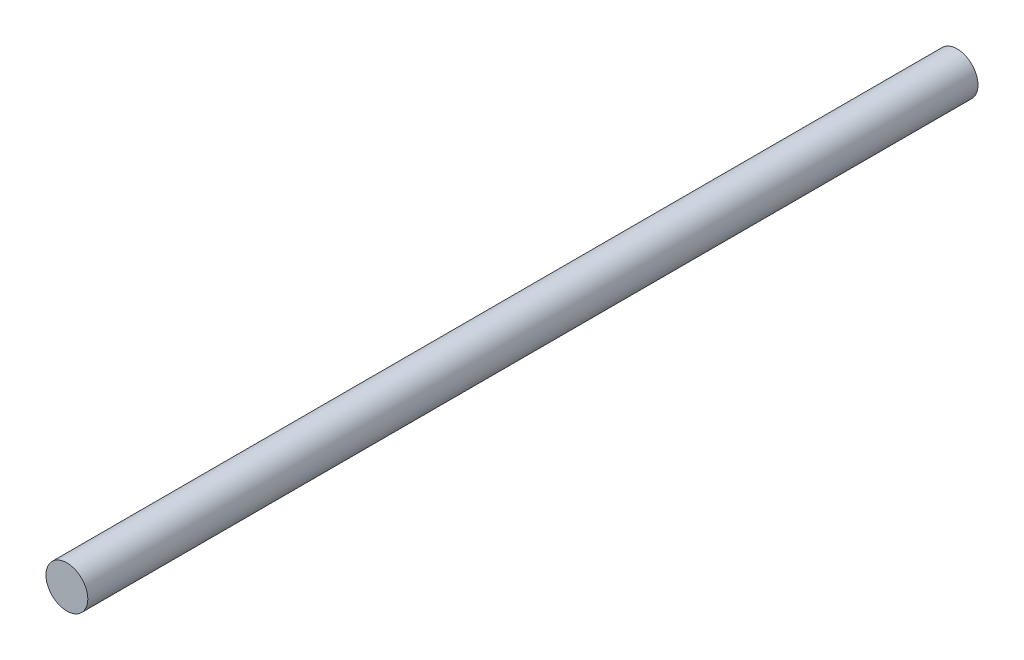
ISO-10303-21;
HEADER;
FILE_DESCRIPTION(('STEP AP214'),'2;1');
FILE_NAME('part.step','',(''),(''),'','','');
FILE_SCHEMA(('AUTOMOTIVE_DESIGN { 1 0 10303 214 1 1 1 1 }'));
ENDSEC;
DATA;
#1=APPLICATION_CONTEXT('core data for automotive mechanical design processes');
#2=APPLICATION_PROTOCOL_DEFINITION('international standard','automotive_design',2000,#1);
#3=PRODUCT_CONTEXT('',#1,'mechanical');
#4=PRODUCT('Part','Part','',(#3));
#5=PRODUCT_RELATED_PRODUCT_CATEGORY('part','',(#4));
#6=PRODUCT_DEFINITION_FORMATION('','',#4);
#7=PRODUCT_DEFINITION_CONTEXT('part definition',#1,'design');
#8=PRODUCT_DEFINITION('design','',#6,#7);
#9=PRODUCT_DEFINITION_SHAPE('','',#8);
#10=(LENGTH_UNIT() NAMED_UNIT(*) SI_UNIT(.MILLI.,.METRE.));
#11=(NAMED_UNIT(*) PLANE_ANGLE_UNIT() SI_UNIT($,.RADIAN.));
#12=(NAMED_UNIT(*) SI_UNIT($,.STERADIAN.) SOLID_ANGLE_UNIT());
#13=UNCERTAINTY_MEASURE_WITH_UNIT(LENGTH_MEASURE(1.E-05),#10,'distance_accuracy_value','');
#14=(GEOMETRIC_REPRESENTATION_CONTEXT(3) GLOBAL_UNCERTAINTY_ASSIGNED_CONTEXT((#13)) GLOBAL_UNIT_ASSIGNED_CONTEXT((#10,
#11,#12)) REPRESENTATION_CONTEXT('',''));
#15=CARTESIAN_POINT('',(0.,0.,0.));
#16=DIRECTION('',(0.,0.,1.));
#17=DIRECTION('',(1.,0.,0.));
#18=AXIS2_PLACEMENT_3D('',#15,#16,#17);
#19=CARTESIAN_POINT('',(0.,0.,-800.));
#20=DIRECTION('',(0.,0.,1.));
#21=DIRECTION('',(1.,0.,0.));
#22=AXIS2_PLACEMENT_3D('',#19,#20,#21);
#23=CYLINDRICAL_SURFACE('',#22,18.8);
#24=CARTESIAN_POINT('',(0.,0.,-800.));
#25=DIRECTION('',(0.,0.,1.));
#26=DIRECTION('',(1.,0.,0.));
#27=AXIS2_PLACEMENT_3D('',#24,#25,#26);
#28=CIRCLE('',#27,18.8);
#29=CARTESIAN_POINT('',(18.8,0.,-800.));
#30=VERTEX_POINT('',#29);
#31=EDGE_CURVE('E10',#30,#30,#28,.T.);
#32=ORIENTED_EDGE('',*,*,#31,.T.);
#33=EDGE_LOOP('',(#32));
#34=FACE_BOUND('',#33,.T.);
#35=CARTESIAN_POINT('',(0.,0.,0.));
#36=DIRECTION('',(0.,0.,1.));
#37=DIRECTION('',(1.,0.,0.));
#38=AXIS2_PLACEMENT_3D('',#35,#36,#37);
#39=CIRCLE('',#38,18.8);
#40=CARTESIAN_POINT('',(18.8,0.,0.));
#41=VERTEX_POINT('',#40);
#42=EDGE_CURVE('E40',#41,#41,#39,.T.);
#43=ORIENTED_EDGE('',*,*,#42,.F.);
#44=EDGE_LOOP('',(#43));
#45=FACE_BOUND('',#44,.T.);
#46=ADVANCED_FACE('F37',(#34,#45),#23,.T.);
#47=CARTESIAN_POINT('',(0.,0.,-800.));
#48=DIRECTION('',(0.,0.,1.));
#49=DIRECTION('',(1.,0.,0.));
#50=AXIS2_PLACEMENT_3D('',#47,#48,#49);
#51=PLANE('',#50);
#52=ORIENTED_EDGE('',*,*,#31,.F.);
#53=EDGE_LOOP('',(#52));
#54=FACE_BOUND('',#53,.T.);
#55=ADVANCED_FACE('F52',(#54),#51,.F.);
#56=CARTESIAN_POINT('',(0.,0.,0.));
#57=DIRECTION('',(0.,0.,1.));
#58=DIRECTION('',(1.,0.,0.));
#59=AXIS2_PLACEMENT_3D('',#56,#57,#58);
#60=PLANE('',#59);
#61=ORIENTED_EDGE('',*,*,#42,.T.);
#62=EDGE_LOOP('',(#61));
#63=FACE_BOUND('',#62,.T.);
#64=ADVANCED_FACE('F49',(#63),#60,.T.);
#65=CLOSED_SHELL('',(#46,#55,#64));
#66=MANIFOLD_SOLID_BREP('B2',#65);
#67=ADVANCED_BREP_SHAPE_REPRESENTATION('',(#18,#66),#14);
#68=SHAPE_DEFINITION_REPRESENTATION(#9,#67);
ENDSEC;
END-ISO-10303-21;
